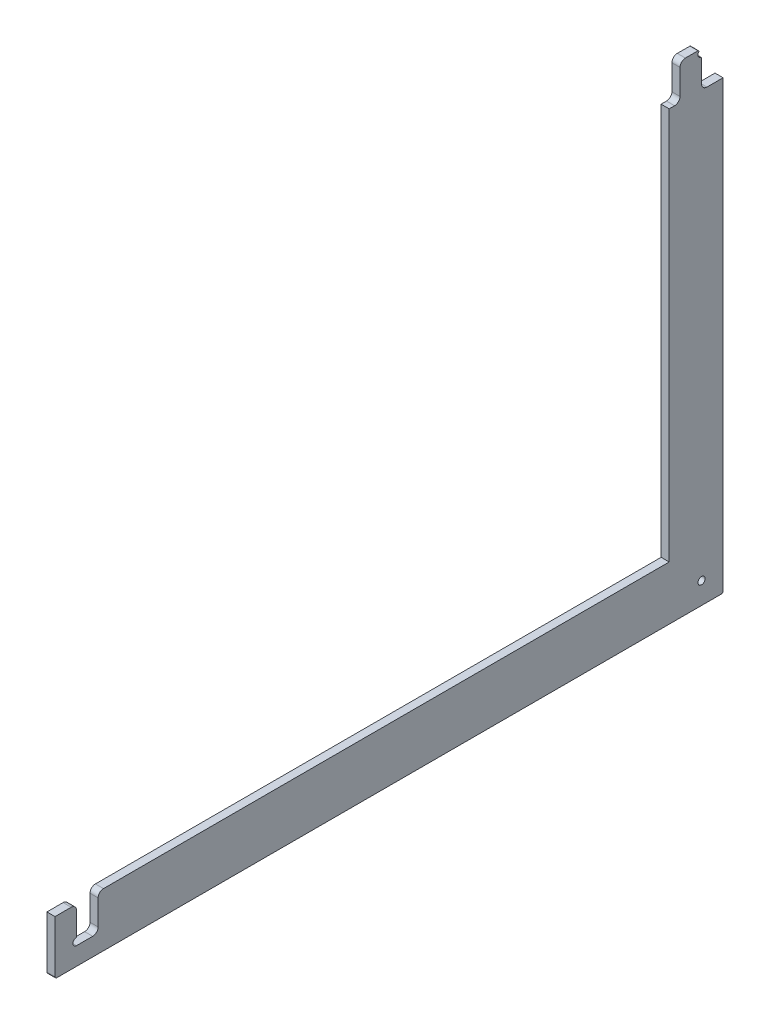
ISO-10303-21;
HEADER;
FILE_DESCRIPTION(('STEP AP214'),'2;1');
FILE_NAME('part.step','',(''),(''),'','','');
FILE_SCHEMA(('AUTOMOTIVE_DESIGN { 1 0 10303 214 1 1 1 1 }'));
ENDSEC;
DATA;
#1=APPLICATION_CONTEXT('core data for automotive mechanical design processes');
#2=APPLICATION_PROTOCOL_DEFINITION('international standard','automotive_design',2000,#1);
#3=PRODUCT_CONTEXT('',#1,'mechanical');
#4=PRODUCT('Part','Part','',(#3));
#5=PRODUCT_RELATED_PRODUCT_CATEGORY('part','',(#4));
#6=PRODUCT_DEFINITION_FORMATION('','',#4);
#7=PRODUCT_DEFINITION_CONTEXT('part definition',#1,'design');
#8=PRODUCT_DEFINITION('design','',#6,#7);
#9=PRODUCT_DEFINITION_SHAPE('','',#8);
#10=(LENGTH_UNIT() NAMED_UNIT(*) SI_UNIT(.MILLI.,.METRE.));
#11=(NAMED_UNIT(*) PLANE_ANGLE_UNIT() SI_UNIT($,.RADIAN.));
#12=(NAMED_UNIT(*) SI_UNIT($,.STERADIAN.) SOLID_ANGLE_UNIT());
#13=UNCERTAINTY_MEASURE_WITH_UNIT(LENGTH_MEASURE(1.E-05),#10,'distance_accuracy_value','');
#14=(GEOMETRIC_REPRESENTATION_CONTEXT(3) GLOBAL_UNCERTAINTY_ASSIGNED_CONTEXT((#13)) GLOBAL_UNIT_ASSIGNED_CONTEXT((#10,
#11,#12)) REPRESENTATION_CONTEXT('',''));
#15=CARTESIAN_POINT('',(0.,0.,0.));
#16=DIRECTION('',(0.,0.,1.));
#17=DIRECTION('',(1.,0.,0.));
#18=AXIS2_PLACEMENT_3D('',#15,#16,#17);
#19=CARTESIAN_POINT('',(4.5,0.,0.));
#20=DIRECTION('',(-1.,0.,0.));
#21=DIRECTION('',(0.,0.,1.));
#22=AXIS2_PLACEMENT_3D('',#19,#20,#21);
#23=PLANE('',#22);
#24=DIRECTION('',(0.,-1.,0.));
#25=VECTOR('',#24,1.);
#26=CARTESIAN_POINT('',(4.5,0.,372.));
#27=LINE('',#26,#25);
#28=CARTESIAN_POINT('',(4.5,30.,372.));
#29=VERTEX_POINT('',#28);
#30=CARTESIAN_POINT('',(4.5,1.,372.));
#31=VERTEX_POINT('',#30);
#32=EDGE_CURVE('E362',#29,#31,#27,.T.);
#33=ORIENTED_EDGE('',*,*,#32,.T.);
#34=CARTESIAN_POINT('',(4.5,1.,371.));
#35=DIRECTION('',(-1.,0.,0.));
#36=DIRECTION('',(0.,0.,1.));
#37=AXIS2_PLACEMENT_3D('',#34,#35,#36);
#38=CIRCLE('',#37,1.);
#39=CARTESIAN_POINT('',(4.5,0.,371.));
#40=VERTEX_POINT('',#39);
#41=EDGE_CURVE('E45',#31,#40,#38,.F.);
#42=ORIENTED_EDGE('',*,*,#41,.T.);
#43=DIRECTION('',(0.,0.,-1.));
#44=VECTOR('',#43,1.);
#45=CARTESIAN_POINT('',(4.5,0.,0.));
#46=LINE('',#45,#44);
#47=CARTESIAN_POINT('',(4.5,0.,1.));
#48=VERTEX_POINT('',#47);
#49=EDGE_CURVE('E361',#40,#48,#46,.T.);
#50=ORIENTED_EDGE('',*,*,#49,.T.);
#51=CARTESIAN_POINT('',(4.5,1.,1.));
#52=DIRECTION('',(-1.,0.,0.));
#53=DIRECTION('',(0.,0.,1.));
#54=AXIS2_PLACEMENT_3D('',#51,#52,#53);
#55=CIRCLE('',#54,1.);
#56=CARTESIAN_POINT('',(4.5,1.00000000000006,0.));
#57=VERTEX_POINT('',#56);
#58=EDGE_CURVE('E52',#48,#57,#55,.F.);
#59=ORIENTED_EDGE('',*,*,#58,.T.);
#60=DIRECTION('',(0.,1.,0.));
#61=VECTOR('',#60,1.);
#62=CARTESIAN_POINT('',(4.5,248.5,0.));
#63=LINE('',#62,#61);
#64=CARTESIAN_POINT('',(4.5,248.5,0.));
#65=VERTEX_POINT('',#64);
#66=EDGE_CURVE('E370',#57,#65,#63,.T.);
#67=ORIENTED_EDGE('',*,*,#66,.T.);
#68=DIRECTION('',(0.,0.,1.));
#69=VECTOR('',#68,1.);
#70=CARTESIAN_POINT('',(4.5,248.5,12.0000000000001));
#71=LINE('',#70,#69);
#72=CARTESIAN_POINT('',(4.5,248.5,9.00000000000008));
#73=VERTEX_POINT('',#72);
#74=EDGE_CURVE('E422',#65,#73,#71,.T.);
#75=ORIENTED_EDGE('',*,*,#74,.T.);
#76=CARTESIAN_POINT('',(4.5,251.5,9.00000000000008));
#77=DIRECTION('',(-1.,0.,0.));
#78=DIRECTION('',(0.,0.,1.));
#79=AXIS2_PLACEMENT_3D('',#76,#77,#78);
#80=CIRCLE('',#79,3.);
#81=CARTESIAN_POINT('',(4.5,251.5,12.0000000000001));
#82=VERTEX_POINT('',#81);
#83=EDGE_CURVE('E331',#73,#82,#80,.T.);
#84=ORIENTED_EDGE('',*,*,#83,.T.);
#85=DIRECTION('',(0.,1.,0.));
#86=VECTOR('',#85,1.);
#87=CARTESIAN_POINT('',(4.5,268.5,12.0000000000001));
#88=LINE('',#87,#86);
#89=CARTESIAN_POINT('',(4.5,264.050510257217,12.0000000000001));
#90=VERTEX_POINT('',#89);
#91=EDGE_CURVE('E425',#82,#90,#88,.T.);
#92=ORIENTED_EDGE('',*,*,#91,.T.);
#93=CARTESIAN_POINT('',(4.5,264.050510257217,12.5000000000001));
#94=DIRECTION('',(-1.,0.,0.));
#95=DIRECTION('',(0.,0.,1.));
#96=AXIS2_PLACEMENT_3D('',#93,#94,#95);
#97=CIRCLE('',#96,0.5);
#98=CARTESIAN_POINT('',(4.5,264.540408205774,12.4));
#99=VERTEX_POINT('',#98);
#100=EDGE_CURVE('E269',#90,#99,#97,.F.);
#101=ORIENTED_EDGE('',*,*,#100,.T.);
#102=CARTESIAN_POINT('',(4.5,266.5,11.9999999999998));
#103=DIRECTION('',(1.,0.,0.));
#104=DIRECTION('',(0.,0.,-1.));
#105=AXIS2_PLACEMENT_3D('',#102,#103,#104);
#106=CIRCLE('',#105,2.);
#107=CARTESIAN_POINT('',(4.5,267.7,13.5999999999998));
#108=VERTEX_POINT('',#107);
#109=EDGE_CURVE('E240',#108,#99,#106,.T.);
#110=ORIENTED_EDGE('',*,*,#109,.F.);
#111=CARTESIAN_POINT('',(4.5,268.,13.9999999999998));
#112=DIRECTION('',(-1.,0.,0.));
#113=DIRECTION('',(0.,0.,1.));
#114=AXIS2_PLACEMENT_3D('',#111,#112,#113);
#115=CIRCLE('',#114,0.5);
#116=CARTESIAN_POINT('',(4.5,268.5,13.9999999999998));
#117=VERTEX_POINT('',#116);
#118=EDGE_CURVE('E285',#108,#117,#115,.F.);
#119=ORIENTED_EDGE('',*,*,#118,.T.);
#120=DIRECTION('',(0.,0.,1.));
#121=VECTOR('',#120,1.);
#122=CARTESIAN_POINT('',(4.5,268.5,24.));
#123=LINE('',#122,#121);
#124=CARTESIAN_POINT('',(4.5,268.5,21.));
#125=VERTEX_POINT('',#124);
#126=EDGE_CURVE('E427',#117,#125,#123,.T.);
#127=ORIENTED_EDGE('',*,*,#126,.T.);
#128=CARTESIAN_POINT('',(4.5,265.5,21.));
#129=DIRECTION('',(-1.,0.,0.));
#130=DIRECTION('',(0.,0.,1.));
#131=AXIS2_PLACEMENT_3D('',#128,#129,#130);
#132=CIRCLE('',#131,3.);
#133=CARTESIAN_POINT('',(4.5,265.5,24.));
#134=VERTEX_POINT('',#133);
#135=EDGE_CURVE('E344',#125,#134,#132,.F.);
#136=ORIENTED_EDGE('',*,*,#135,.T.);
#137=DIRECTION('',(0.,-1.,0.));
#138=VECTOR('',#137,1.);
#139=CARTESIAN_POINT('',(4.5,248.5,24.));
#140=LINE('',#139,#138);
#141=CARTESIAN_POINT('',(4.5,251.5,24.));
#142=VERTEX_POINT('',#141);
#143=EDGE_CURVE('E430',#134,#142,#140,.T.);
#144=ORIENTED_EDGE('',*,*,#143,.T.);
#145=CARTESIAN_POINT('',(4.5,251.5,27.));
#146=DIRECTION('',(-1.,0.,0.));
#147=DIRECTION('',(0.,0.,1.));
#148=AXIS2_PLACEMENT_3D('',#145,#146,#147);
#149=CIRCLE('',#148,3.);
#150=CARTESIAN_POINT('',(4.5,248.5,27.));
#151=VERTEX_POINT('',#150);
#152=EDGE_CURVE('E327',#142,#151,#149,.T.);
#153=ORIENTED_EDGE('',*,*,#152,.T.);
#154=DIRECTION('',(0.,0.,1.));
#155=VECTOR('',#154,1.);
#156=CARTESIAN_POINT('',(4.5,248.5,30.));
#157=LINE('',#156,#155);
#158=CARTESIAN_POINT('',(4.5,248.5,30.));
#159=VERTEX_POINT('',#158);
#160=EDGE_CURVE('E432',#151,#159,#157,.T.);
#161=ORIENTED_EDGE('',*,*,#160,.T.);
#162=DIRECTION('',(0.,-1.,0.));
#163=VECTOR('',#162,1.);
#164=CARTESIAN_POINT('',(4.5,30.,30.));
#165=LINE('',#164,#163);
#166=CARTESIAN_POINT('',(4.5,30.,30.));
#167=VERTEX_POINT('',#166);
#168=EDGE_CURVE('E434',#159,#167,#165,.T.);
#169=ORIENTED_EDGE('',*,*,#168,.T.);
#170=DIRECTION('',(0.,0.,1.));
#171=VECTOR('',#170,1.);
#172=CARTESIAN_POINT('',(4.5,30.,30.));
#173=LINE('',#172,#171);
#174=CARTESIAN_POINT('',(4.5,30.,345.));
#175=VERTEX_POINT('',#174);
#176=EDGE_CURVE('E436',#167,#175,#173,.T.);
#177=ORIENTED_EDGE('',*,*,#176,.T.);
#178=CARTESIAN_POINT('',(4.5,27.,345.));
#179=DIRECTION('',(-1.,0.,0.));
#180=DIRECTION('',(0.,0.,1.));
#181=AXIS2_PLACEMENT_3D('',#178,#179,#180);
#182=CIRCLE('',#181,3.);
#183=CARTESIAN_POINT('',(4.5,27.,348.));
#184=VERTEX_POINT('',#183);
#185=EDGE_CURVE('E317',#175,#184,#182,.F.);
#186=ORIENTED_EDGE('',*,*,#185,.T.);
#187=DIRECTION('',(0.,-1.,0.));
#188=VECTOR('',#187,1.);
#189=CARTESIAN_POINT('',(4.5,9.99999999999995,348.));
#190=LINE('',#189,#188);
#191=CARTESIAN_POINT('',(4.5,12.9999999999999,348.));
#192=VERTEX_POINT('',#191);
#193=EDGE_CURVE('E231',#184,#192,#190,.T.);
#194=ORIENTED_EDGE('',*,*,#193,.T.);
#195=CARTESIAN_POINT('',(4.5,12.9999999999999,351.));
#196=DIRECTION('',(-1.,0.,0.));
#197=DIRECTION('',(0.,0.,1.));
#198=AXIS2_PLACEMENT_3D('',#195,#196,#197);
#199=CIRCLE('',#198,3.);
#200=CARTESIAN_POINT('',(4.5,9.99999999999995,351.));
#201=VERTEX_POINT('',#200);
#202=EDGE_CURVE('E225',#192,#201,#199,.T.);
#203=ORIENTED_EDGE('',*,*,#202,.T.);
#204=DIRECTION('',(0.,0.,1.));
#205=VECTOR('',#204,1.);
#206=CARTESIAN_POINT('',(4.5,9.99999999999995,360.));
#207=LINE('',#206,#205);
#208=CARTESIAN_POINT('',(4.5,9.99999999999996,360.));
#209=VERTEX_POINT('',#208);
#210=EDGE_CURVE('E218',#201,#209,#207,.T.);
#211=ORIENTED_EDGE('',*,*,#210,.T.);
#212=CARTESIAN_POINT('',(4.5,12.,360.));
#213=DIRECTION('',(1.,0.,0.));
#214=DIRECTION('',(0.,0.,-1.));
#215=AXIS2_PLACEMENT_3D('',#212,#213,#214);
#216=CIRCLE('',#215,2.);
#217=CARTESIAN_POINT('',(4.5,13.9595917942265,360.4));
#218=VERTEX_POINT('',#217);
#219=EDGE_CURVE('E221',#218,#209,#216,.T.);
#220=ORIENTED_EDGE('',*,*,#219,.F.);
#221=CARTESIAN_POINT('',(4.5,14.4494897427831,360.5));
#222=DIRECTION('',(-1.,0.,0.));
#223=DIRECTION('',(0.,0.,1.));
#224=AXIS2_PLACEMENT_3D('',#221,#222,#223);
#225=CIRCLE('',#224,0.5);
#226=CARTESIAN_POINT('',(4.5,14.4494897427831,360.));
#227=VERTEX_POINT('',#226);
#228=EDGE_CURVE('E293',#218,#227,#225,.F.);
#229=ORIENTED_EDGE('',*,*,#228,.T.);
#230=DIRECTION('',(0.,1.,0.));
#231=VECTOR('',#230,1.);
#232=CARTESIAN_POINT('',(4.5,30.,360.));
#233=LINE('',#232,#231);
#234=CARTESIAN_POINT('',(4.5,27.,360.));
#235=VERTEX_POINT('',#234);
#236=EDGE_CURVE('E230',#227,#235,#233,.T.);
#237=ORIENTED_EDGE('',*,*,#236,.T.);
#238=CARTESIAN_POINT('',(4.5,27.,363.));
#239=DIRECTION('',(-1.,0.,0.));
#240=DIRECTION('',(0.,0.,1.));
#241=AXIS2_PLACEMENT_3D('',#238,#239,#240);
#242=CIRCLE('',#241,3.);
#243=CARTESIAN_POINT('',(4.5,30.,363.));
#244=VERTEX_POINT('',#243);
#245=EDGE_CURVE('E315',#235,#244,#242,.F.);
#246=ORIENTED_EDGE('',*,*,#245,.T.);
#247=DIRECTION('',(0.,0.,1.));
#248=VECTOR('',#247,1.);
#249=CARTESIAN_POINT('',(4.5,30.,360.));
#250=LINE('',#249,#248);
#251=EDGE_CURVE('E410',#244,#29,#250,.T.);
#252=ORIENTED_EDGE('',*,*,#251,.T.);
#253=EDGE_LOOP('',(#33,#42,#50,#59,#67,#75,#84,#92,#101,#110,#119,#127,#136,#144,#153,#161,#169,
#177,#186,#194,#203,#211,#220,#229,#237,#246,#252));
#254=FACE_BOUND('',#253,.T.);
#255=CARTESIAN_POINT('',(4.5,12.,12.));
#256=DIRECTION('',(1.,0.,0.));
#257=DIRECTION('',(0.,0.,-1.));
#258=AXIS2_PLACEMENT_3D('',#255,#256,#257);
#259=CIRCLE('',#258,2.);
#260=CARTESIAN_POINT('',(4.5,12.,9.99999999999997));
#261=VERTEX_POINT('',#260);
#262=EDGE_CURVE('E386',#261,#261,#259,.T.);
#263=ORIENTED_EDGE('',*,*,#262,.F.);
#264=EDGE_LOOP('',(#263));
#265=FACE_BOUND('',#264,.T.);
#266=ADVANCED_FACE('F37',(#254,#265),#23,.F.);
#267=CARTESIAN_POINT('',(0.,0.,0.));
#268=DIRECTION('',(-1.,0.,0.));
#269=DIRECTION('',(0.,0.,1.));
#270=AXIS2_PLACEMENT_3D('',#267,#268,#269);
#271=PLANE('',#270);
#272=DIRECTION('',(0.,0.,-1.));
#273=VECTOR('',#272,1.);
#274=CARTESIAN_POINT('',(0.,0.,0.));
#275=LINE('',#274,#273);
#276=CARTESIAN_POINT('',(0.,0.,371.));
#277=VERTEX_POINT('',#276);
#278=CARTESIAN_POINT('',(0.,0.,1.));
#279=VERTEX_POINT('',#278);
#280=EDGE_CURVE('E379',#277,#279,#275,.T.);
#281=ORIENTED_EDGE('',*,*,#280,.F.);
#282=CARTESIAN_POINT('',(0.,1.,371.));
#283=DIRECTION('',(-1.,0.,0.));
#284=DIRECTION('',(0.,0.,1.));
#285=AXIS2_PLACEMENT_3D('',#282,#283,#284);
#286=CIRCLE('',#285,1.);
#287=CARTESIAN_POINT('',(0.,1.,372.));
#288=VERTEX_POINT('',#287);
#289=EDGE_CURVE('E356',#277,#288,#286,.T.);
#290=ORIENTED_EDGE('',*,*,#289,.T.);
#291=DIRECTION('',(0.,-1.,0.));
#292=VECTOR('',#291,1.);
#293=CARTESIAN_POINT('',(0.,0.,372.));
#294=LINE('',#293,#292);
#295=CARTESIAN_POINT('',(0.,30.,372.));
#296=VERTEX_POINT('',#295);
#297=EDGE_CURVE('E378',#296,#288,#294,.T.);
#298=ORIENTED_EDGE('',*,*,#297,.F.);
#299=DIRECTION('',(0.,0.,1.));
#300=VECTOR('',#299,1.);
#301=CARTESIAN_POINT('',(0.,30.,360.));
#302=LINE('',#301,#300);
#303=CARTESIAN_POINT('',(0.,30.,363.));
#304=VERTEX_POINT('',#303);
#305=EDGE_CURVE('E382',#304,#296,#302,.T.);
#306=ORIENTED_EDGE('',*,*,#305,.F.);
#307=CARTESIAN_POINT('',(0.,27.,363.));
#308=DIRECTION('',(-1.,0.,0.));
#309=DIRECTION('',(0.,0.,1.));
#310=AXIS2_PLACEMENT_3D('',#307,#308,#309);
#311=CIRCLE('',#310,3.);
#312=CARTESIAN_POINT('',(0.,27.,360.));
#313=VERTEX_POINT('',#312);
#314=EDGE_CURVE('E309',#304,#313,#311,.T.);
#315=ORIENTED_EDGE('',*,*,#314,.T.);
#316=DIRECTION('',(0.,1.,0.));
#317=VECTOR('',#316,1.);
#318=CARTESIAN_POINT('',(0.,30.,360.));
#319=LINE('',#318,#317);
#320=CARTESIAN_POINT('',(0.,14.4494897427831,360.));
#321=VERTEX_POINT('',#320);
#322=EDGE_CURVE('E255',#321,#313,#319,.T.);
#323=ORIENTED_EDGE('',*,*,#322,.F.);
#324=CARTESIAN_POINT('',(0.,14.4494897427831,360.5));
#325=DIRECTION('',(-1.,0.,0.));
#326=DIRECTION('',(0.,0.,1.));
#327=AXIS2_PLACEMENT_3D('',#324,#325,#326);
#328=CIRCLE('',#327,0.5);
#329=CARTESIAN_POINT('',(0.,13.9595917942265,360.4));
#330=VERTEX_POINT('',#329);
#331=EDGE_CURVE('E290',#321,#330,#328,.T.);
#332=ORIENTED_EDGE('',*,*,#331,.T.);
#333=CARTESIAN_POINT('',(0.,12.,360.));
#334=DIRECTION('',(1.,0.,0.));
#335=DIRECTION('',(0.,0.,-1.));
#336=AXIS2_PLACEMENT_3D('',#333,#334,#335);
#337=CIRCLE('',#336,2.);
#338=CARTESIAN_POINT('',(0.,9.99999999999996,360.));
#339=VERTEX_POINT('',#338);
#340=EDGE_CURVE('E241',#330,#339,#337,.T.);
#341=ORIENTED_EDGE('',*,*,#340,.T.);
#342=DIRECTION('',(0.,0.,1.));
#343=VECTOR('',#342,1.);
#344=CARTESIAN_POINT('',(0.,9.99999999999995,360.));
#345=LINE('',#344,#343);
#346=CARTESIAN_POINT('',(0.,9.99999999999995,351.));
#347=VERTEX_POINT('',#346);
#348=EDGE_CURVE('E245',#347,#339,#345,.T.);
#349=ORIENTED_EDGE('',*,*,#348,.F.);
#350=CARTESIAN_POINT('',(0.,12.9999999999999,351.));
#351=DIRECTION('',(-1.,0.,0.));
#352=DIRECTION('',(0.,0.,1.));
#353=AXIS2_PLACEMENT_3D('',#350,#351,#352);
#354=CIRCLE('',#353,3.);
#355=CARTESIAN_POINT('',(0.,12.9999999999999,348.));
#356=VERTEX_POINT('',#355);
#357=EDGE_CURVE('E346',#347,#356,#354,.F.);
#358=ORIENTED_EDGE('',*,*,#357,.T.);
#359=DIRECTION('',(0.,-1.,0.));
#360=VECTOR('',#359,1.);
#361=CARTESIAN_POINT('',(0.,9.99999999999995,348.));
#362=LINE('',#361,#360);
#363=CARTESIAN_POINT('',(0.,27.,348.));
#364=VERTEX_POINT('',#363);
#365=EDGE_CURVE('E407',#364,#356,#362,.T.);
#366=ORIENTED_EDGE('',*,*,#365,.F.);
#367=CARTESIAN_POINT('',(0.,27.,345.));
#368=DIRECTION('',(-1.,0.,0.));
#369=DIRECTION('',(0.,0.,1.));
#370=AXIS2_PLACEMENT_3D('',#367,#368,#369);
#371=CIRCLE('',#370,3.);
#372=CARTESIAN_POINT('',(0.,30.,345.));
#373=VERTEX_POINT('',#372);
#374=EDGE_CURVE('E311',#364,#373,#371,.T.);
#375=ORIENTED_EDGE('',*,*,#374,.T.);
#376=DIRECTION('',(0.,0.,1.));
#377=VECTOR('',#376,1.);
#378=CARTESIAN_POINT('',(0.,30.,30.));
#379=LINE('',#378,#377);
#380=CARTESIAN_POINT('',(0.,30.,30.));
#381=VERTEX_POINT('',#380);
#382=EDGE_CURVE('E404',#381,#373,#379,.T.);
#383=ORIENTED_EDGE('',*,*,#382,.F.);
#384=DIRECTION('',(0.,-1.,0.));
#385=VECTOR('',#384,1.);
#386=CARTESIAN_POINT('',(0.,30.,30.));
#387=LINE('',#386,#385);
#388=CARTESIAN_POINT('',(0.,248.5,30.));
#389=VERTEX_POINT('',#388);
#390=EDGE_CURVE('E402',#389,#381,#387,.T.);
#391=ORIENTED_EDGE('',*,*,#390,.F.);
#392=DIRECTION('',(0.,0.,1.));
#393=VECTOR('',#392,1.);
#394=CARTESIAN_POINT('',(0.,248.5,30.));
#395=LINE('',#394,#393);
#396=CARTESIAN_POINT('',(0.,248.5,27.));
#397=VERTEX_POINT('',#396);
#398=EDGE_CURVE('E400',#397,#389,#395,.T.);
#399=ORIENTED_EDGE('',*,*,#398,.F.);
#400=CARTESIAN_POINT('',(0.,251.5,27.));
#401=DIRECTION('',(-1.,0.,0.));
#402=DIRECTION('',(0.,0.,1.));
#403=AXIS2_PLACEMENT_3D('',#400,#401,#402);
#404=CIRCLE('',#403,3.);
#405=CARTESIAN_POINT('',(0.,251.5,24.));
#406=VERTEX_POINT('',#405);
#407=EDGE_CURVE('E324',#397,#406,#404,.F.);
#408=ORIENTED_EDGE('',*,*,#407,.T.);
#409=DIRECTION('',(0.,-1.,0.));
#410=VECTOR('',#409,1.);
#411=CARTESIAN_POINT('',(0.,248.5,24.));
#412=LINE('',#411,#410);
#413=CARTESIAN_POINT('',(0.,265.5,24.));
#414=VERTEX_POINT('',#413);
#415=EDGE_CURVE('E398',#414,#406,#412,.T.);
#416=ORIENTED_EDGE('',*,*,#415,.F.);
#417=CARTESIAN_POINT('',(0.,265.5,21.));
#418=DIRECTION('',(-1.,0.,0.));
#419=DIRECTION('',(0.,0.,1.));
#420=AXIS2_PLACEMENT_3D('',#417,#418,#419);
#421=CIRCLE('',#420,3.);
#422=CARTESIAN_POINT('',(0.,268.5,21.));
#423=VERTEX_POINT('',#422);
#424=EDGE_CURVE('E340',#414,#423,#421,.T.);
#425=ORIENTED_EDGE('',*,*,#424,.T.);
#426=DIRECTION('',(0.,0.,1.));
#427=VECTOR('',#426,1.);
#428=CARTESIAN_POINT('',(0.,268.5,24.));
#429=LINE('',#428,#427);
#430=CARTESIAN_POINT('',(0.,268.5,13.9999999999998));
#431=VERTEX_POINT('',#430);
#432=EDGE_CURVE('E395',#431,#423,#429,.T.);
#433=ORIENTED_EDGE('',*,*,#432,.F.);
#434=CARTESIAN_POINT('',(0.,268.,13.9999999999998));
#435=DIRECTION('',(-1.,0.,0.));
#436=DIRECTION('',(0.,0.,1.));
#437=AXIS2_PLACEMENT_3D('',#434,#435,#436);
#438=CIRCLE('',#437,0.5);
#439=CARTESIAN_POINT('',(0.,267.7,13.5999999999998));
#440=VERTEX_POINT('',#439);
#441=EDGE_CURVE('E281',#431,#440,#438,.T.);
#442=ORIENTED_EDGE('',*,*,#441,.T.);
#443=CARTESIAN_POINT('',(0.,266.5,11.9999999999998));
#444=DIRECTION('',(1.,0.,0.));
#445=DIRECTION('',(0.,0.,-1.));
#446=AXIS2_PLACEMENT_3D('',#443,#444,#445);
#447=CIRCLE('',#446,2.);
#448=CARTESIAN_POINT('',(0.,264.540408205774,12.4));
#449=VERTEX_POINT('',#448);
#450=EDGE_CURVE('E453',#440,#449,#447,.T.);
#451=ORIENTED_EDGE('',*,*,#450,.T.);
#452=CARTESIAN_POINT('',(0.,264.050510257217,12.5000000000001));
#453=DIRECTION('',(-1.,0.,0.));
#454=DIRECTION('',(0.,0.,1.));
#455=AXIS2_PLACEMENT_3D('',#452,#453,#454);
#456=CIRCLE('',#455,0.5);
#457=CARTESIAN_POINT('',(0.,264.050510257217,12.0000000000001));
#458=VERTEX_POINT('',#457);
#459=EDGE_CURVE('E275',#449,#458,#456,.T.);
#460=ORIENTED_EDGE('',*,*,#459,.T.);
#461=DIRECTION('',(0.,1.,0.));
#462=VECTOR('',#461,1.);
#463=CARTESIAN_POINT('',(0.,268.5,12.0000000000001));
#464=LINE('',#463,#462);
#465=CARTESIAN_POINT('',(0.,251.5,12.0000000000001));
#466=VERTEX_POINT('',#465);
#467=EDGE_CURVE('E393',#466,#458,#464,.T.);
#468=ORIENTED_EDGE('',*,*,#467,.F.);
#469=CARTESIAN_POINT('',(0.,251.5,9.00000000000008));
#470=DIRECTION('',(-1.,0.,0.));
#471=DIRECTION('',(0.,0.,1.));
#472=AXIS2_PLACEMENT_3D('',#469,#470,#471);
#473=CIRCLE('',#472,3.);
#474=CARTESIAN_POINT('',(0.,248.5,9.00000000000008));
#475=VERTEX_POINT('',#474);
#476=EDGE_CURVE('E329',#466,#475,#473,.F.);
#477=ORIENTED_EDGE('',*,*,#476,.T.);
#478=DIRECTION('',(0.,0.,1.));
#479=VECTOR('',#478,1.);
#480=CARTESIAN_POINT('',(0.,248.5,12.0000000000001));
#481=LINE('',#480,#479);
#482=CARTESIAN_POINT('',(0.,248.5,0.));
#483=VERTEX_POINT('',#482);
#484=EDGE_CURVE('E390',#483,#475,#481,.T.);
#485=ORIENTED_EDGE('',*,*,#484,.F.);
#486=DIRECTION('',(0.,1.,0.));
#487=VECTOR('',#486,1.);
#488=CARTESIAN_POINT('',(0.,248.5,0.));
#489=LINE('',#488,#487);
#490=CARTESIAN_POINT('',(0.,1.00000000000006,0.));
#491=VERTEX_POINT('',#490);
#492=EDGE_CURVE('E384',#491,#483,#489,.T.);
#493=ORIENTED_EDGE('',*,*,#492,.F.);
#494=CARTESIAN_POINT('',(0.,1.,1.));
#495=DIRECTION('',(-1.,0.,0.));
#496=DIRECTION('',(0.,0.,1.));
#497=AXIS2_PLACEMENT_3D('',#494,#495,#496);
#498=CIRCLE('',#497,1.);
#499=EDGE_CURVE('E354',#491,#279,#498,.T.);
#500=ORIENTED_EDGE('',*,*,#499,.T.);
#501=EDGE_LOOP('',(#281,#290,#298,#306,#315,#323,#332,#341,#349,#358,#366,#375,#383,#391,#399,
#408,#416,#425,#433,#442,#451,#460,#468,#477,#485,#493,#500));
#502=FACE_BOUND('',#501,.T.);
#503=CARTESIAN_POINT('',(0.,12.,12.));
#504=DIRECTION('',(1.,0.,0.));
#505=DIRECTION('',(0.,0.,-1.));
#506=AXIS2_PLACEMENT_3D('',#503,#504,#505);
#507=CIRCLE('',#506,2.);
#508=CARTESIAN_POINT('',(0.,12.,9.99999999999997));
#509=VERTEX_POINT('',#508);
#510=EDGE_CURVE('E418',#509,#509,#507,.T.);
#511=ORIENTED_EDGE('',*,*,#510,.T.);
#512=EDGE_LOOP('',(#511));
#513=FACE_BOUND('',#512,.T.);
#514=ADVANCED_FACE('F375',(#502,#513),#271,.T.);
#515=CARTESIAN_POINT('',(4.5,30.,360.));
#516=DIRECTION('',(0.,-1.,0.));
#517=DIRECTION('',(0.,0.,-1.));
#518=AXIS2_PLACEMENT_3D('',#515,#516,#517);
#519=PLANE('',#518);
#520=ORIENTED_EDGE('',*,*,#251,.F.);
#521=DIRECTION('',(-1.,0.,0.));
#522=VECTOR('',#521,1.);
#523=CARTESIAN_POINT('',(4.5,30.,363.));
#524=LINE('',#523,#522);
#525=EDGE_CURVE('E319',#244,#304,#524,.T.);
#526=ORIENTED_EDGE('',*,*,#525,.T.);
#527=ORIENTED_EDGE('',*,*,#305,.T.);
#528=DIRECTION('',(-1.,0.,0.));
#529=VECTOR('',#528,1.);
#530=CARTESIAN_POINT('',(4.5,30.,372.));
#531=LINE('',#530,#529);
#532=EDGE_CURVE('E263',#29,#296,#531,.T.);
#533=ORIENTED_EDGE('',*,*,#532,.F.);
#534=EDGE_LOOP('',(#520,#526,#527,#533));
#535=FACE_BOUND('',#534,.T.);
#536=ADVANCED_FACE('F497',(#535),#519,.F.);
#537=CARTESIAN_POINT('',(4.5,0.,372.));
#538=DIRECTION('',(0.,0.,-1.));
#539=DIRECTION('',(-1.,0.,0.));
#540=AXIS2_PLACEMENT_3D('',#537,#538,#539);
#541=PLANE('',#540);
#542=ORIENTED_EDGE('',*,*,#297,.T.);
#543=DIRECTION('',(-1.,0.,0.));
#544=VECTOR('',#543,1.);
#545=CARTESIAN_POINT('',(4.5,1.,372.));
#546=LINE('',#545,#544);
#547=EDGE_CURVE('E60',#288,#31,#546,.F.);
#548=ORIENTED_EDGE('',*,*,#547,.T.);
#549=ORIENTED_EDGE('',*,*,#32,.F.);
#550=ORIENTED_EDGE('',*,*,#532,.T.);
#551=EDGE_LOOP('',(#542,#548,#549,#550));
#552=FACE_BOUND('',#551,.T.);
#553=ADVANCED_FACE('F380',(#552),#541,.F.);
#554=CARTESIAN_POINT('',(4.5,0.,0.));
#555=DIRECTION('',(0.,1.,0.));
#556=DIRECTION('',(0.,0.,1.));
#557=AXIS2_PLACEMENT_3D('',#554,#555,#556);
#558=PLANE('',#557);
#559=ORIENTED_EDGE('',*,*,#49,.F.);
#560=DIRECTION('',(-1.,0.,0.));
#561=VECTOR('',#560,1.);
#562=CARTESIAN_POINT('',(4.5,0.,371.));
#563=LINE('',#562,#561);
#564=EDGE_CURVE('E351',#40,#277,#563,.T.);
#565=ORIENTED_EDGE('',*,*,#564,.T.);
#566=ORIENTED_EDGE('',*,*,#280,.T.);
#567=DIRECTION('',(-1.,0.,0.));
#568=VECTOR('',#567,1.);
#569=CARTESIAN_POINT('',(4.5,0.,1.));
#570=LINE('',#569,#568);
#571=EDGE_CURVE('E349',#279,#48,#570,.F.);
#572=ORIENTED_EDGE('',*,*,#571,.T.);
#573=EDGE_LOOP('',(#559,#565,#566,#572));
#574=FACE_BOUND('',#573,.T.);
#575=ADVANCED_FACE('F366',(#574),#558,.F.);
#576=CARTESIAN_POINT('',(4.5,248.5,0.));
#577=DIRECTION('',(0.,0.,1.));
#578=DIRECTION('',(1.,0.,0.));
#579=AXIS2_PLACEMENT_3D('',#576,#577,#578);
#580=PLANE('',#579);
#581=ORIENTED_EDGE('',*,*,#66,.F.);
#582=DIRECTION('',(-1.,0.,0.));
#583=VECTOR('',#582,1.);
#584=CARTESIAN_POINT('',(4.5,1.,0.));
#585=LINE('',#584,#583);
#586=EDGE_CURVE('E11',#57,#491,#585,.T.);
#587=ORIENTED_EDGE('',*,*,#586,.T.);
#588=ORIENTED_EDGE('',*,*,#492,.T.);
#589=DIRECTION('',(-1.,0.,0.));
#590=VECTOR('',#589,1.);
#591=CARTESIAN_POINT('',(4.5,248.5,0.));
#592=LINE('',#591,#590);
#593=EDGE_CURVE('E260',#65,#483,#592,.T.);
#594=ORIENTED_EDGE('',*,*,#593,.F.);
#595=EDGE_LOOP('',(#581,#587,#588,#594));
#596=FACE_BOUND('',#595,.T.);
#597=ADVANCED_FACE('F484',(#596),#580,.F.);
#598=CARTESIAN_POINT('',(4.5,248.5,12.0000000000001));
#599=DIRECTION('',(0.,-1.,0.));
#600=DIRECTION('',(0.,0.,-1.));
#601=AXIS2_PLACEMENT_3D('',#598,#599,#600);
#602=PLANE('',#601);
#603=ORIENTED_EDGE('',*,*,#484,.T.);
#604=DIRECTION('',(-1.,0.,0.));
#605=VECTOR('',#604,1.);
#606=CARTESIAN_POINT('',(4.5,248.5,9.00000000000008));
#607=LINE('',#606,#605);
#608=EDGE_CURVE('E304',#475,#73,#607,.F.);
#609=ORIENTED_EDGE('',*,*,#608,.T.);
#610=ORIENTED_EDGE('',*,*,#74,.F.);
#611=ORIENTED_EDGE('',*,*,#593,.T.);
#612=EDGE_LOOP('',(#603,#609,#610,#611));
#613=FACE_BOUND('',#612,.T.);
#614=ADVANCED_FACE('F480',(#613),#602,.F.);
#615=CARTESIAN_POINT('',(4.5,268.5,12.0000000000001));
#616=DIRECTION('',(0.,0.,1.));
#617=DIRECTION('',(0.,-1.,0.));
#618=AXIS2_PLACEMENT_3D('',#615,#616,#617);
#619=PLANE('',#618);
#620=ORIENTED_EDGE('',*,*,#91,.F.);
#621=DIRECTION('',(-1.,0.,0.));
#622=VECTOR('',#621,1.);
#623=CARTESIAN_POINT('',(0.,251.5,12.0000000000001));
#624=LINE('',#623,#622);
#625=EDGE_CURVE('E301',#82,#466,#624,.T.);
#626=ORIENTED_EDGE('',*,*,#625,.T.);
#627=ORIENTED_EDGE('',*,*,#467,.T.);
#628=DIRECTION('',(1.,0.,0.));
#629=VECTOR('',#628,1.);
#630=CARTESIAN_POINT('',(4.5,264.050510257217,12.0000000000001));
#631=LINE('',#630,#629);
#632=EDGE_CURVE('E266',#458,#90,#631,.T.);
#633=ORIENTED_EDGE('',*,*,#632,.T.);
#634=EDGE_LOOP('',(#620,#626,#627,#633));
#635=FACE_BOUND('',#634,.T.);
#636=ADVANCED_FACE('F472',(#635),#619,.F.);
#637=CARTESIAN_POINT('',(4.5,268.5,24.));
#638=DIRECTION('',(0.,-1.,0.));
#639=DIRECTION('',(0.,0.,-1.));
#640=AXIS2_PLACEMENT_3D('',#637,#638,#639);
#641=PLANE('',#640);
#642=ORIENTED_EDGE('',*,*,#432,.T.);
#643=DIRECTION('',(-1.,0.,0.));
#644=VECTOR('',#643,1.);
#645=CARTESIAN_POINT('',(4.5,268.5,21.));
#646=LINE('',#645,#644);
#647=EDGE_CURVE('E342',#423,#125,#646,.F.);
#648=ORIENTED_EDGE('',*,*,#647,.T.);
#649=ORIENTED_EDGE('',*,*,#126,.F.);
#650=DIRECTION('',(1.,0.,0.));
#651=VECTOR('',#650,1.);
#652=CARTESIAN_POINT('',(4.5,268.5,13.9999999999998));
#653=LINE('',#652,#651);
#654=EDGE_CURVE('E278',#117,#431,#653,.F.);
#655=ORIENTED_EDGE('',*,*,#654,.T.);
#656=EDGE_LOOP('',(#642,#648,#649,#655));
#657=FACE_BOUND('',#656,.T.);
#658=ADVANCED_FACE('F526',(#657),#641,.F.);
#659=CARTESIAN_POINT('',(4.5,248.5,24.));
#660=DIRECTION('',(0.,0.,-1.));
#661=DIRECTION('',(0.,1.,0.));
#662=AXIS2_PLACEMENT_3D('',#659,#660,#661);
#663=PLANE('',#662);
#664=ORIENTED_EDGE('',*,*,#143,.F.);
#665=DIRECTION('',(-1.,0.,0.));
#666=VECTOR('',#665,1.);
#667=CARTESIAN_POINT('',(4.5,265.5,24.));
#668=LINE('',#667,#666);
#669=EDGE_CURVE('E337',#134,#414,#668,.T.);
#670=ORIENTED_EDGE('',*,*,#669,.T.);
#671=ORIENTED_EDGE('',*,*,#415,.T.);
#672=DIRECTION('',(-1.,0.,0.));
#673=VECTOR('',#672,1.);
#674=CARTESIAN_POINT('',(4.5,251.5,24.));
#675=LINE('',#674,#673);
#676=EDGE_CURVE('E298',#406,#142,#675,.F.);
#677=ORIENTED_EDGE('',*,*,#676,.T.);
#678=EDGE_LOOP('',(#664,#670,#671,#677));
#679=FACE_BOUND('',#678,.T.);
#680=ADVANCED_FACE('F522',(#679),#663,.F.);
#681=CARTESIAN_POINT('',(4.5,248.5,30.));
#682=DIRECTION('',(0.,-1.,0.));
#683=DIRECTION('',(0.,0.,-1.));
#684=AXIS2_PLACEMENT_3D('',#681,#682,#683);
#685=PLANE('',#684);
#686=ORIENTED_EDGE('',*,*,#160,.F.);
#687=DIRECTION('',(-1.,0.,0.));
#688=VECTOR('',#687,1.);
#689=CARTESIAN_POINT('',(0.,248.5,27.));
#690=LINE('',#689,#688);
#691=EDGE_CURVE('E295',#151,#397,#690,.T.);
#692=ORIENTED_EDGE('',*,*,#691,.T.);
#693=ORIENTED_EDGE('',*,*,#398,.T.);
#694=DIRECTION('',(-1.,0.,0.));
#695=VECTOR('',#694,1.);
#696=CARTESIAN_POINT('',(4.5,248.5,30.));
#697=LINE('',#696,#695);
#698=EDGE_CURVE('E250',#159,#389,#697,.T.);
#699=ORIENTED_EDGE('',*,*,#698,.F.);
#700=EDGE_LOOP('',(#686,#692,#693,#699));
#701=FACE_BOUND('',#700,.T.);
#702=ADVANCED_FACE('F518',(#701),#685,.F.);
#703=CARTESIAN_POINT('',(4.5,30.,30.));
#704=DIRECTION('',(0.,0.,-1.));
#705=DIRECTION('',(-1.,0.,0.));
#706=AXIS2_PLACEMENT_3D('',#703,#704,#705);
#707=PLANE('',#706);
#708=ORIENTED_EDGE('',*,*,#390,.T.);
#709=DIRECTION('',(-1.,0.,0.));
#710=VECTOR('',#709,1.);
#711=CARTESIAN_POINT('',(4.5,30.,30.));
#712=LINE('',#711,#710);
#713=EDGE_CURVE('E247',#167,#381,#712,.T.);
#714=ORIENTED_EDGE('',*,*,#713,.F.);
#715=ORIENTED_EDGE('',*,*,#168,.F.);
#716=ORIENTED_EDGE('',*,*,#698,.T.);
#717=EDGE_LOOP('',(#708,#714,#715,#716));
#718=FACE_BOUND('',#717,.T.);
#719=ADVANCED_FACE('F514',(#718),#707,.F.);
#720=CARTESIAN_POINT('',(4.5,30.,30.));
#721=DIRECTION('',(0.,-1.,0.));
#722=DIRECTION('',(0.,0.,-1.));
#723=AXIS2_PLACEMENT_3D('',#720,#721,#722);
#724=PLANE('',#723);
#725=ORIENTED_EDGE('',*,*,#382,.T.);
#726=DIRECTION('',(-1.,0.,0.));
#727=VECTOR('',#726,1.);
#728=CARTESIAN_POINT('',(4.5,30.,345.));
#729=LINE('',#728,#727);
#730=EDGE_CURVE('E313',#373,#175,#729,.F.);
#731=ORIENTED_EDGE('',*,*,#730,.T.);
#732=ORIENTED_EDGE('',*,*,#176,.F.);
#733=ORIENTED_EDGE('',*,*,#713,.T.);
#734=EDGE_LOOP('',(#725,#731,#732,#733));
#735=FACE_BOUND('',#734,.T.);
#736=ADVANCED_FACE('F511',(#735),#724,.F.);
#737=CARTESIAN_POINT('',(4.5,9.99999999999995,348.));
#738=DIRECTION('',(0.,0.,-1.));
#739=DIRECTION('',(-1.,0.,0.));
#740=AXIS2_PLACEMENT_3D('',#737,#738,#739);
#741=PLANE('',#740);
#742=ORIENTED_EDGE('',*,*,#365,.T.);
#743=DIRECTION('',(-1.,0.,0.));
#744=VECTOR('',#743,1.);
#745=CARTESIAN_POINT('',(4.5,12.9999999999999,348.));
#746=LINE('',#745,#744);
#747=EDGE_CURVE('E335',#356,#192,#746,.F.);
#748=ORIENTED_EDGE('',*,*,#747,.T.);
#749=ORIENTED_EDGE('',*,*,#193,.F.);
#750=DIRECTION('',(-1.,0.,0.));
#751=VECTOR('',#750,1.);
#752=CARTESIAN_POINT('',(4.5,27.,348.));
#753=LINE('',#752,#751);
#754=EDGE_CURVE('E306',#184,#364,#753,.T.);
#755=ORIENTED_EDGE('',*,*,#754,.T.);
#756=EDGE_LOOP('',(#742,#748,#749,#755));
#757=FACE_BOUND('',#756,.T.);
#758=ADVANCED_FACE('F508',(#757),#741,.F.);
#759=CARTESIAN_POINT('',(4.5,9.99999999999995,360.));
#760=DIRECTION('',(0.,-1.,0.));
#761=DIRECTION('',(0.,0.,-1.));
#762=AXIS2_PLACEMENT_3D('',#759,#760,#761);
#763=PLANE('',#762);
#764=ORIENTED_EDGE('',*,*,#210,.F.);
#765=DIRECTION('',(-1.,0.,0.));
#766=VECTOR('',#765,1.);
#767=CARTESIAN_POINT('',(0.,9.99999999999995,351.));
#768=LINE('',#767,#766);
#769=EDGE_CURVE('E333',#201,#347,#768,.T.);
#770=ORIENTED_EDGE('',*,*,#769,.T.);
#771=ORIENTED_EDGE('',*,*,#348,.T.);
#772=DIRECTION('',(-1.,0.,0.));
#773=VECTOR('',#772,1.);
#774=CARTESIAN_POINT('',(4.5,9.99999999999995,360.));
#775=LINE('',#774,#773);
#776=EDGE_CURVE('E237',#209,#339,#775,.T.);
#777=ORIENTED_EDGE('',*,*,#776,.F.);
#778=EDGE_LOOP('',(#764,#770,#771,#777));
#779=FACE_BOUND('',#778,.T.);
#780=ADVANCED_FACE('F243',(#779),#763,.F.);
#781=CARTESIAN_POINT('',(4.5,30.,360.));
#782=DIRECTION('',(0.,0.,1.));
#783=DIRECTION('',(1.,0.,0.));
#784=AXIS2_PLACEMENT_3D('',#781,#782,#783);
#785=PLANE('',#784);
#786=ORIENTED_EDGE('',*,*,#322,.T.);
#787=DIRECTION('',(-1.,0.,0.));
#788=VECTOR('',#787,1.);
#789=CARTESIAN_POINT('',(4.5,27.,360.));
#790=LINE('',#789,#788);
#791=EDGE_CURVE('E322',#313,#235,#790,.F.);
#792=ORIENTED_EDGE('',*,*,#791,.T.);
#793=ORIENTED_EDGE('',*,*,#236,.F.);
#794=DIRECTION('',(1.,0.,0.));
#795=VECTOR('',#794,1.);
#796=CARTESIAN_POINT('',(4.5,14.4494897427831,360.));
#797=LINE('',#796,#795);
#798=EDGE_CURVE('E287',#227,#321,#797,.F.);
#799=ORIENTED_EDGE('',*,*,#798,.T.);
#800=EDGE_LOOP('',(#786,#792,#793,#799));
#801=FACE_BOUND('',#800,.T.);
#802=ADVANCED_FACE('F503',(#801),#785,.F.);
#803=CARTESIAN_POINT('',(4.5,12.,12.));
#804=DIRECTION('',(-1.,0.,0.));
#805=DIRECTION('',(0.,0.,1.));
#806=AXIS2_PLACEMENT_3D('',#803,#804,#805);
#807=CYLINDRICAL_SURFACE('',#806,2.);
#808=ORIENTED_EDGE('',*,*,#262,.T.);
#809=EDGE_LOOP('',(#808));
#810=FACE_BOUND('',#809,.T.);
#811=ORIENTED_EDGE('',*,*,#510,.F.);
#812=EDGE_LOOP('',(#811));
#813=FACE_BOUND('',#812,.T.);
#814=ADVANCED_FACE('F500',(#810,#813),#807,.F.);
#815=CARTESIAN_POINT('',(0.,12.,360.));
#816=DIRECTION('',(1.,0.,0.));
#817=DIRECTION('',(0.,0.,-1.));
#818=AXIS2_PLACEMENT_3D('',#815,#816,#817);
#819=CYLINDRICAL_SURFACE('',#818,2.);
#820=ORIENTED_EDGE('',*,*,#340,.F.);
#821=DIRECTION('',(1.,0.,0.));
#822=VECTOR('',#821,1.);
#823=CARTESIAN_POINT('',(0.,13.9595917942265,360.4));
#824=LINE('',#823,#822);
#825=EDGE_CURVE('E239',#330,#218,#824,.T.);
#826=ORIENTED_EDGE('',*,*,#825,.T.);
#827=ORIENTED_EDGE('',*,*,#219,.T.);
#828=ORIENTED_EDGE('',*,*,#776,.T.);
#829=EDGE_LOOP('',(#820,#826,#827,#828));
#830=FACE_BOUND('',#829,.T.);
#831=ADVANCED_FACE('F236',(#830),#819,.F.);
#832=CARTESIAN_POINT('',(0.,266.5,11.9999999999998));
#833=DIRECTION('',(1.,0.,0.));
#834=DIRECTION('',(0.,0.,-1.));
#835=AXIS2_PLACEMENT_3D('',#832,#833,#834);
#836=CYLINDRICAL_SURFACE('',#835,2.);
#837=ORIENTED_EDGE('',*,*,#450,.F.);
#838=DIRECTION('',(1.,0.,0.));
#839=VECTOR('',#838,1.);
#840=CARTESIAN_POINT('',(0.,267.7,13.5999999999998));
#841=LINE('',#840,#839);
#842=EDGE_CURVE('E283',#440,#108,#841,.T.);
#843=ORIENTED_EDGE('',*,*,#842,.T.);
#844=ORIENTED_EDGE('',*,*,#109,.T.);
#845=DIRECTION('',(1.,0.,0.));
#846=VECTOR('',#845,1.);
#847=CARTESIAN_POINT('',(0.,264.540408205774,12.4));
#848=LINE('',#847,#846);
#849=EDGE_CURVE('E272',#99,#449,#848,.F.);
#850=ORIENTED_EDGE('',*,*,#849,.T.);
#851=EDGE_LOOP('',(#837,#843,#844,#850));
#852=FACE_BOUND('',#851,.T.);
#853=ADVANCED_FACE('F459',(#852),#836,.F.);
#854=CARTESIAN_POINT('',(0.,264.050510257217,12.5000000000001));
#855=DIRECTION('',(1.,0.,0.));
#856=DIRECTION('',(0.,0.,-1.));
#857=AXIS2_PLACEMENT_3D('',#854,#855,#856);
#858=CYLINDRICAL_SURFACE('',#857,0.5);
#859=ORIENTED_EDGE('',*,*,#459,.F.);
#860=ORIENTED_EDGE('',*,*,#849,.F.);
#861=ORIENTED_EDGE('',*,*,#100,.F.);
#862=ORIENTED_EDGE('',*,*,#632,.F.);
#863=EDGE_LOOP('',(#859,#860,#861,#862));
#864=FACE_BOUND('',#863,.T.);
#865=ADVANCED_FACE('F468',(#864),#858,.T.);
#866=CARTESIAN_POINT('',(0.,268.,13.9999999999998));
#867=DIRECTION('',(1.,0.,0.));
#868=DIRECTION('',(0.,0.,-1.));
#869=AXIS2_PLACEMENT_3D('',#866,#867,#868);
#870=CYLINDRICAL_SURFACE('',#869,0.5);
#871=ORIENTED_EDGE('',*,*,#118,.F.);
#872=ORIENTED_EDGE('',*,*,#842,.F.);
#873=ORIENTED_EDGE('',*,*,#441,.F.);
#874=ORIENTED_EDGE('',*,*,#654,.F.);
#875=EDGE_LOOP('',(#871,#872,#873,#874));
#876=FACE_BOUND('',#875,.T.);
#877=ADVANCED_FACE('F546',(#876),#870,.T.);
#878=CARTESIAN_POINT('',(0.,14.4494897427831,360.5));
#879=DIRECTION('',(1.,0.,0.));
#880=DIRECTION('',(0.,0.,-1.));
#881=AXIS2_PLACEMENT_3D('',#878,#879,#880);
#882=CYLINDRICAL_SURFACE('',#881,0.5);
#883=ORIENTED_EDGE('',*,*,#228,.F.);
#884=ORIENTED_EDGE('',*,*,#825,.F.);
#885=ORIENTED_EDGE('',*,*,#331,.F.);
#886=ORIENTED_EDGE('',*,*,#798,.F.);
#887=EDGE_LOOP('',(#883,#884,#885,#886));
#888=FACE_BOUND('',#887,.T.);
#889=ADVANCED_FACE('F549',(#888),#882,.T.);
#890=CARTESIAN_POINT('',(4.5,251.5,27.));
#891=DIRECTION('',(1.,0.,0.));
#892=DIRECTION('',(0.,0.,-1.));
#893=AXIS2_PLACEMENT_3D('',#890,#891,#892);
#894=CYLINDRICAL_SURFACE('',#893,3.);
#895=ORIENTED_EDGE('',*,*,#152,.F.);
#896=ORIENTED_EDGE('',*,*,#676,.F.);
#897=ORIENTED_EDGE('',*,*,#407,.F.);
#898=ORIENTED_EDGE('',*,*,#691,.F.);
#899=EDGE_LOOP('',(#895,#896,#897,#898));
#900=FACE_BOUND('',#899,.T.);
#901=ADVANCED_FACE('F553',(#900),#894,.F.);
#902=CARTESIAN_POINT('',(4.5,251.5,9.00000000000008));
#903=DIRECTION('',(1.,0.,0.));
#904=DIRECTION('',(0.,0.,-1.));
#905=AXIS2_PLACEMENT_3D('',#902,#903,#904);
#906=CYLINDRICAL_SURFACE('',#905,3.);
#907=ORIENTED_EDGE('',*,*,#83,.F.);
#908=ORIENTED_EDGE('',*,*,#608,.F.);
#909=ORIENTED_EDGE('',*,*,#476,.F.);
#910=ORIENTED_EDGE('',*,*,#625,.F.);
#911=EDGE_LOOP('',(#907,#908,#909,#910));
#912=FACE_BOUND('',#911,.T.);
#913=ADVANCED_FACE('F476',(#912),#906,.F.);
#914=CARTESIAN_POINT('',(4.5,27.,345.));
#915=DIRECTION('',(-1.,0.,0.));
#916=DIRECTION('',(0.,0.,1.));
#917=AXIS2_PLACEMENT_3D('',#914,#915,#916);
#918=CYLINDRICAL_SURFACE('',#917,3.);
#919=ORIENTED_EDGE('',*,*,#185,.F.);
#920=ORIENTED_EDGE('',*,*,#730,.F.);
#921=ORIENTED_EDGE('',*,*,#374,.F.);
#922=ORIENTED_EDGE('',*,*,#754,.F.);
#923=EDGE_LOOP('',(#919,#920,#921,#922));
#924=FACE_BOUND('',#923,.T.);
#925=ADVANCED_FACE('F560',(#924),#918,.T.);
#926=CARTESIAN_POINT('',(4.5,27.,363.));
#927=DIRECTION('',(-1.,0.,0.));
#928=DIRECTION('',(0.,0.,1.));
#929=AXIS2_PLACEMENT_3D('',#926,#927,#928);
#930=CYLINDRICAL_SURFACE('',#929,3.);
#931=ORIENTED_EDGE('',*,*,#245,.F.);
#932=ORIENTED_EDGE('',*,*,#791,.F.);
#933=ORIENTED_EDGE('',*,*,#314,.F.);
#934=ORIENTED_EDGE('',*,*,#525,.F.);
#935=EDGE_LOOP('',(#931,#932,#933,#934));
#936=FACE_BOUND('',#935,.T.);
#937=ADVANCED_FACE('F563',(#936),#930,.T.);
#938=CARTESIAN_POINT('',(4.5,12.9999999999999,351.));
#939=DIRECTION('',(1.,0.,0.));
#940=DIRECTION('',(0.,0.,-1.));
#941=AXIS2_PLACEMENT_3D('',#938,#939,#940);
#942=CYLINDRICAL_SURFACE('',#941,3.);
#943=ORIENTED_EDGE('',*,*,#202,.F.);
#944=ORIENTED_EDGE('',*,*,#747,.F.);
#945=ORIENTED_EDGE('',*,*,#357,.F.);
#946=ORIENTED_EDGE('',*,*,#769,.F.);
#947=EDGE_LOOP('',(#943,#944,#945,#946));
#948=FACE_BOUND('',#947,.T.);
#949=ADVANCED_FACE('F445',(#948),#942,.F.);
#950=CARTESIAN_POINT('',(4.5,265.5,21.));
#951=DIRECTION('',(-1.,0.,0.));
#952=DIRECTION('',(0.,0.,1.));
#953=AXIS2_PLACEMENT_3D('',#950,#951,#952);
#954=CYLINDRICAL_SURFACE('',#953,3.);
#955=ORIENTED_EDGE('',*,*,#135,.F.);
#956=ORIENTED_EDGE('',*,*,#647,.F.);
#957=ORIENTED_EDGE('',*,*,#424,.F.);
#958=ORIENTED_EDGE('',*,*,#669,.F.);
#959=EDGE_LOOP('',(#955,#956,#957,#958));
#960=FACE_BOUND('',#959,.T.);
#961=ADVANCED_FACE('F491',(#960),#954,.T.);
#962=CARTESIAN_POINT('',(4.5,1.,371.));
#963=DIRECTION('',(-1.,0.,0.));
#964=DIRECTION('',(0.,0.,1.));
#965=AXIS2_PLACEMENT_3D('',#962,#963,#964);
#966=CYLINDRICAL_SURFACE('',#965,1.);
#967=ORIENTED_EDGE('',*,*,#41,.F.);
#968=ORIENTED_EDGE('',*,*,#547,.F.);
#969=ORIENTED_EDGE('',*,*,#289,.F.);
#970=ORIENTED_EDGE('',*,*,#564,.F.);
#971=EDGE_LOOP('',(#967,#968,#969,#970));
#972=FACE_BOUND('',#971,.T.);
#973=ADVANCED_FACE('F372',(#972),#966,.T.);
#974=CARTESIAN_POINT('',(4.5,1.,1.));
#975=DIRECTION('',(-1.,0.,0.));
#976=DIRECTION('',(0.,0.,1.));
#977=AXIS2_PLACEMENT_3D('',#974,#975,#976);
#978=CYLINDRICAL_SURFACE('',#977,1.);
#979=ORIENTED_EDGE('',*,*,#58,.F.);
#980=ORIENTED_EDGE('',*,*,#571,.F.);
#981=ORIENTED_EDGE('',*,*,#499,.F.);
#982=ORIENTED_EDGE('',*,*,#586,.F.);
#983=EDGE_LOOP('',(#979,#980,#981,#982));
#984=FACE_BOUND('',#983,.T.);
#985=ADVANCED_FACE('F39',(#984),#978,.T.);
#986=CLOSED_SHELL('',(#266,#514,#536,#553,#575,#597,#614,#636,#658,#680,#702,#719,#736,#758,
#780,#802,#814,#831,#853,#865,#877,#889,#901,#913,#925,#937,#949,#961,#973,#985));
#987=MANIFOLD_SOLID_BREP('B2',#986);
#988=ADVANCED_BREP_SHAPE_REPRESENTATION('',(#18,#987),#14);
#989=SHAPE_DEFINITION_REPRESENTATION(#9,#988);
ENDSEC;
END-ISO-10303-21;
